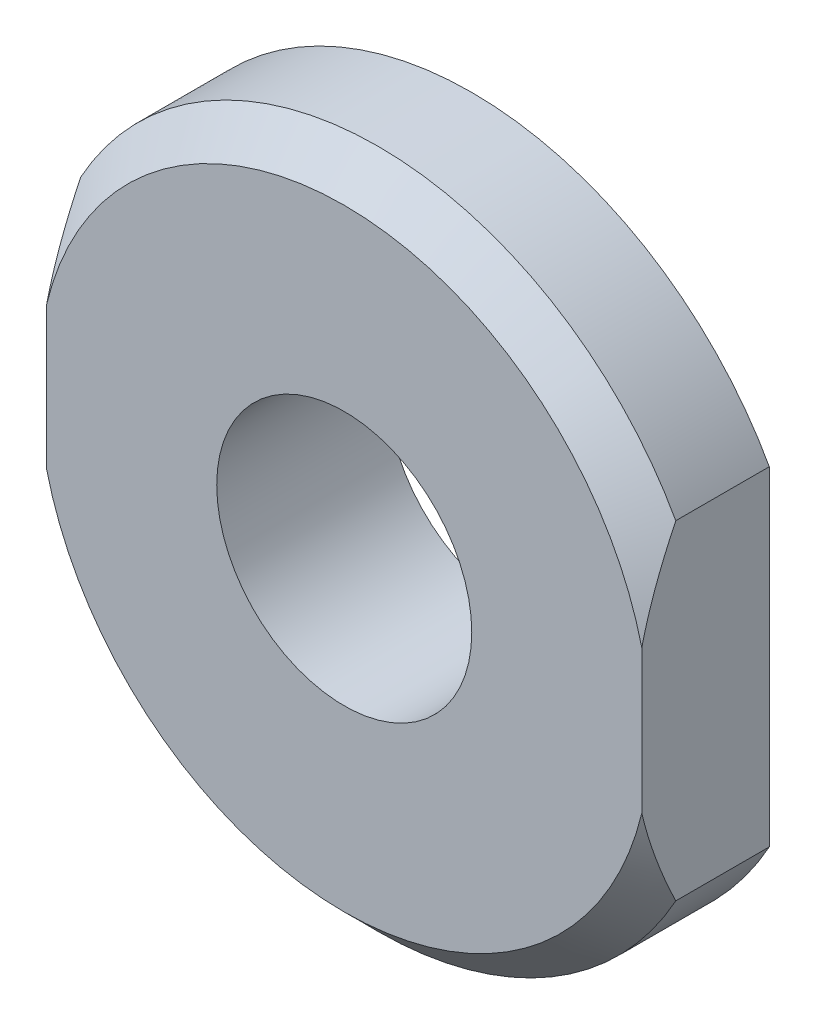
ISO-10303-21;
HEADER;
FILE_DESCRIPTION(('STEP AP214'),'2;1');
FILE_NAME('part.step','',(''),(''),'','','');
FILE_SCHEMA(('AUTOMOTIVE_DESIGN { 1 0 10303 214 1 1 1 1 }'));
ENDSEC;
DATA;
#1=APPLICATION_CONTEXT('core data for automotive mechanical design processes');
#2=APPLICATION_PROTOCOL_DEFINITION('international standard','automotive_design',2000,#1);
#3=PRODUCT_CONTEXT('',#1,'mechanical');
#4=PRODUCT('Part','Part','',(#3));
#5=PRODUCT_RELATED_PRODUCT_CATEGORY('part','',(#4));
#6=PRODUCT_DEFINITION_FORMATION('','',#4);
#7=PRODUCT_DEFINITION_CONTEXT('part definition',#1,'design');
#8=PRODUCT_DEFINITION('design','',#6,#7);
#9=PRODUCT_DEFINITION_SHAPE('','',#8);
#10=(LENGTH_UNIT() NAMED_UNIT(*) SI_UNIT(.MILLI.,.METRE.));
#11=(NAMED_UNIT(*) PLANE_ANGLE_UNIT() SI_UNIT($,.RADIAN.));
#12=(NAMED_UNIT(*) SI_UNIT($,.STERADIAN.) SOLID_ANGLE_UNIT());
#13=UNCERTAINTY_MEASURE_WITH_UNIT(LENGTH_MEASURE(1.E-05),#10,'distance_accuracy_value','');
#14=(GEOMETRIC_REPRESENTATION_CONTEXT(3) GLOBAL_UNCERTAINTY_ASSIGNED_CONTEXT((#13)) GLOBAL_UNIT_ASSIGNED_CONTEXT((#10,
#11,#12)) REPRESENTATION_CONTEXT('',''));
#15=CARTESIAN_POINT('',(0.,0.,0.));
#16=DIRECTION('',(0.,0.,1.));
#17=DIRECTION('',(1.,0.,0.));
#18=AXIS2_PLACEMENT_3D('',#15,#16,#17);
#19=CARTESIAN_POINT('',(0.,0.,1.5));
#20=DIRECTION('',(0.,0.,-1.));
#21=DIRECTION('',(-1.,0.,0.));
#22=AXIS2_PLACEMENT_3D('',#19,#20,#21);
#23=CYLINDRICAL_SURFACE('',#22,4.);
#24=DIRECTION('',(0.,0.,-1.));
#25=VECTOR('',#24,1.);
#26=CARTESIAN_POINT('',(3.5,-1.93649167310371,1.5));
#27=LINE('',#26,#25);
#28=CARTESIAN_POINT('',(3.5,-1.93649167310371,1.1));
#29=VERTEX_POINT('',#28);
#30=CARTESIAN_POINT('',(3.5,-1.93649167310371,0.));
#31=VERTEX_POINT('',#30);
#32=EDGE_CURVE('E99',#29,#31,#27,.T.);
#33=ORIENTED_EDGE('',*,*,#32,.F.);
#34=CARTESIAN_POINT('',(0.,0.,1.1));
#35=DIRECTION('',(0.,0.,1.));
#36=DIRECTION('',(1.,0.,0.));
#37=AXIS2_PLACEMENT_3D('',#34,#35,#36);
#38=CIRCLE('',#37,4.);
#39=CARTESIAN_POINT('',(-3.5,-1.93649167310371,1.1));
#40=VERTEX_POINT('',#39);
#41=EDGE_CURVE('E11',#29,#40,#38,.F.);
#42=ORIENTED_EDGE('',*,*,#41,.T.);
#43=DIRECTION('',(0.,0.,-1.));
#44=VECTOR('',#43,1.);
#45=CARTESIAN_POINT('',(-3.5,-1.93649167310371,1.5));
#46=LINE('',#45,#44);
#47=CARTESIAN_POINT('',(-3.5,-1.93649167310371,0.));
#48=VERTEX_POINT('',#47);
#49=EDGE_CURVE('E121',#40,#48,#46,.T.);
#50=ORIENTED_EDGE('',*,*,#49,.T.);
#51=CARTESIAN_POINT('',(0.,0.,0.));
#52=DIRECTION('',(0.,0.,1.));
#53=DIRECTION('',(1.,0.,0.));
#54=AXIS2_PLACEMENT_3D('',#51,#52,#53);
#55=CIRCLE('',#54,4.);
#56=EDGE_CURVE('E115',#48,#31,#55,.T.);
#57=ORIENTED_EDGE('',*,*,#56,.T.);
#58=EDGE_LOOP('',(#33,#42,#50,#57));
#59=FACE_BOUND('',#58,.T.);
#60=ADVANCED_FACE('F45',(#59),#23,.T.);
#61=CARTESIAN_POINT('',(3.5,1.93649167310371,1.5));
#62=DIRECTION('',(-1.,0.,0.));
#63=DIRECTION('',(0.,0.,1.));
#64=AXIS2_PLACEMENT_3D('',#61,#62,#63);
#65=PLANE('',#64);
#66=DIRECTION('',(0.,0.,-1.));
#67=VECTOR('',#66,1.);
#68=CARTESIAN_POINT('',(3.5,1.93649167310371,1.5));
#69=LINE('',#68,#67);
#70=CARTESIAN_POINT('',(3.5,1.93649167310371,1.1));
#71=VERTEX_POINT('',#70);
#72=CARTESIAN_POINT('',(3.5,1.93649167310371,0.));
#73=VERTEX_POINT('',#72);
#74=EDGE_CURVE('E109',#71,#73,#69,.T.);
#75=ORIENTED_EDGE('',*,*,#74,.F.);
#76=CARTESIAN_POINT('',(3.5,1.93649167310371,1.1));
#77=CARTESIAN_POINT('',(3.5,1.84885796034154,1.14241192293));
#78=CARTESIAN_POINT('',(3.5,1.76034011899979,1.18307345825536));
#79=CARTESIAN_POINT('',(3.5,1.58174808259513,1.26002292845541));
#80=CARTESIAN_POINT('',(3.5,1.49167942656025,1.29632376293444));
#81=CARTESIAN_POINT('',(3.5,1.30961778482799,1.36396363769677));
#82=CARTESIAN_POINT('',(3.5,1.21762379645835,1.39530001594116));
#83=CARTESIAN_POINT('',(3.5,1.03157611514035,1.45222420471047));
#84=CARTESIAN_POINT('',(3.5,0.937517002172146,1.47779421558135));
#85=CARTESIAN_POINT('',(3.5,0.842614977317646,1.5));
#86=B_SPLINE_CURVE_WITH_KNOTS('',3,(#76,#77,#78,#79,#80,#81,#82,#83,#84,#85),.UNSPECIFIED.,.F.,
.F.,(4,2,2,2,4),(0.,0.292100435962516,0.583314328026074,0.874683849988349,1.16694082338258),.UNSPECIFIED.);
#87=CARTESIAN_POINT('',(3.5,0.842614977317646,1.5));
#88=VERTEX_POINT('',#87);
#89=EDGE_CURVE('E56',#71,#88,#86,.T.);
#90=ORIENTED_EDGE('',*,*,#89,.T.);
#91=DIRECTION('',(0.,1.,0.));
#92=VECTOR('',#91,1.);
#93=CARTESIAN_POINT('',(3.5,1.93649167310371,1.5));
#94=LINE('',#93,#92);
#95=CARTESIAN_POINT('',(3.5,-0.842614977317645,1.5));
#96=VERTEX_POINT('',#95);
#97=EDGE_CURVE('E139',#96,#88,#94,.T.);
#98=ORIENTED_EDGE('',*,*,#97,.F.);
#99=CARTESIAN_POINT('',(3.5,-0.842614977317646,1.5));
#100=CARTESIAN_POINT('',(3.5,-0.937517002172147,1.47779421558135));
#101=CARTESIAN_POINT('',(3.5,-1.03157611514035,1.45222420471047));
#102=CARTESIAN_POINT('',(3.5,-1.21762379645835,1.39530001594116));
#103=CARTESIAN_POINT('',(3.5,-1.30961778482799,1.36396363769677));
#104=CARTESIAN_POINT('',(3.5,-1.49167942656025,1.29632376293444));
#105=CARTESIAN_POINT('',(3.5,-1.58174808259513,1.26002292845541));
#106=CARTESIAN_POINT('',(3.5,-1.76034011899979,1.18307345825535));
#107=CARTESIAN_POINT('',(3.5,-1.84885796034154,1.14241192293));
#108=CARTESIAN_POINT('',(3.5,-1.93649167310371,1.1));
#109=B_SPLINE_CURVE_WITH_KNOTS('',3,(#99,#100,#101,#102,#103,#104,#105,#106,#107,#108),
.UNSPECIFIED.,.F.,.F.,(4,2,2,2,4),(0.,0.292256973394233,0.583626495356509,0.874840387420067,
1.16694082338258),.UNSPECIFIED.);
#110=EDGE_CURVE('E63',#96,#29,#109,.T.);
#111=ORIENTED_EDGE('',*,*,#110,.T.);
#112=ORIENTED_EDGE('',*,*,#32,.T.);
#113=DIRECTION('',(0.,1.,0.));
#114=VECTOR('',#113,1.);
#115=CARTESIAN_POINT('',(3.5,1.93649167310371,0.));
#116=LINE('',#115,#114);
#117=EDGE_CURVE('E102',#31,#73,#116,.T.);
#118=ORIENTED_EDGE('',*,*,#117,.T.);
#119=EDGE_LOOP('',(#75,#90,#98,#111,#112,#118));
#120=FACE_BOUND('',#119,.T.);
#121=ADVANCED_FACE('F101',(#120),#65,.F.);
#122=CARTESIAN_POINT('',(0.,0.,1.5));
#123=DIRECTION('',(0.,0.,-1.));
#124=DIRECTION('',(-1.,0.,0.));
#125=AXIS2_PLACEMENT_3D('',#122,#123,#124);
#126=CYLINDRICAL_SURFACE('',#125,4.);
#127=DIRECTION('',(0.,0.,-1.));
#128=VECTOR('',#127,1.);
#129=CARTESIAN_POINT('',(-3.5,1.93649167310371,1.5));
#130=LINE('',#129,#128);
#131=CARTESIAN_POINT('',(-3.5,1.93649167310371,1.1));
#132=VERTEX_POINT('',#131);
#133=CARTESIAN_POINT('',(-3.5,1.93649167310371,0.));
#134=VERTEX_POINT('',#133);
#135=EDGE_CURVE('E142',#132,#134,#130,.T.);
#136=ORIENTED_EDGE('',*,*,#135,.F.);
#137=CARTESIAN_POINT('',(0.,0.,1.1));
#138=DIRECTION('',(0.,0.,1.));
#139=DIRECTION('',(1.,0.,0.));
#140=AXIS2_PLACEMENT_3D('',#137,#138,#139);
#141=CIRCLE('',#140,4.);
#142=EDGE_CURVE('E71',#132,#71,#141,.F.);
#143=ORIENTED_EDGE('',*,*,#142,.T.);
#144=ORIENTED_EDGE('',*,*,#74,.T.);
#145=CARTESIAN_POINT('',(0.,0.,0.));
#146=DIRECTION('',(0.,0.,1.));
#147=DIRECTION('',(1.,0.,0.));
#148=AXIS2_PLACEMENT_3D('',#145,#146,#147);
#149=CIRCLE('',#148,4.);
#150=EDGE_CURVE('E117',#73,#134,#149,.T.);
#151=ORIENTED_EDGE('',*,*,#150,.T.);
#152=EDGE_LOOP('',(#136,#143,#144,#151));
#153=FACE_BOUND('',#152,.T.);
#154=ADVANCED_FACE('F175',(#153),#126,.T.);
#155=CARTESIAN_POINT('',(-3.5,1.93649167310371,1.5));
#156=DIRECTION('',(1.,0.,0.));
#157=DIRECTION('',(0.,0.,-1.));
#158=AXIS2_PLACEMENT_3D('',#155,#156,#157);
#159=PLANE('',#158);
#160=DIRECTION('',(0.,-1.,0.));
#161=VECTOR('',#160,1.);
#162=CARTESIAN_POINT('',(-3.5,1.93649167310371,1.5));
#163=LINE('',#162,#161);
#164=CARTESIAN_POINT('',(-3.5,0.842614977317646,1.5));
#165=VERTEX_POINT('',#164);
#166=CARTESIAN_POINT('',(-3.5,-0.842614977317645,1.5));
#167=VERTEX_POINT('',#166);
#168=EDGE_CURVE('E131',#165,#167,#163,.T.);
#169=ORIENTED_EDGE('',*,*,#168,.F.);
#170=CARTESIAN_POINT('',(-3.5,0.842614977317646,1.5));
#171=CARTESIAN_POINT('',(-3.5,0.937517002172146,1.47779421558135));
#172=CARTESIAN_POINT('',(-3.5,1.03157611514035,1.45222420471047));
#173=CARTESIAN_POINT('',(-3.5,1.21762379645835,1.39530001594116));
#174=CARTESIAN_POINT('',(-3.5,1.30961778482799,1.36396363769677));
#175=CARTESIAN_POINT('',(-3.5,1.49167942656025,1.29632376293444));
#176=CARTESIAN_POINT('',(-3.5,1.58174808259513,1.26002292845541));
#177=CARTESIAN_POINT('',(-3.5,1.76034011899979,1.18307345825535));
#178=CARTESIAN_POINT('',(-3.5,1.84885796034154,1.14241192293));
#179=CARTESIAN_POINT('',(-3.5,1.93649167310371,1.1));
#180=B_SPLINE_CURVE_WITH_KNOTS('',3,(#170,#171,#172,#173,#174,#175,#176,#177,#178,#179),
.UNSPECIFIED.,.F.,.F.,(4,2,2,2,4),(0.,0.292256973394233,0.583626495356509,0.874840387420067,
1.16694082338258),.UNSPECIFIED.);
#181=EDGE_CURVE('E163',#165,#132,#180,.T.);
#182=ORIENTED_EDGE('',*,*,#181,.T.);
#183=ORIENTED_EDGE('',*,*,#135,.T.);
#184=DIRECTION('',(0.,-1.,0.));
#185=VECTOR('',#184,1.);
#186=CARTESIAN_POINT('',(-3.5,1.93649167310371,0.));
#187=LINE('',#186,#185);
#188=EDGE_CURVE('E136',#134,#48,#187,.T.);
#189=ORIENTED_EDGE('',*,*,#188,.T.);
#190=ORIENTED_EDGE('',*,*,#49,.F.);
#191=CARTESIAN_POINT('',(-3.5,-1.93649167310371,1.1));
#192=CARTESIAN_POINT('',(-3.5,-1.84885796034154,1.14241192293));
#193=CARTESIAN_POINT('',(-3.5,-1.76034011899979,1.18307345825535));
#194=CARTESIAN_POINT('',(-3.5,-1.58174808259513,1.26002292845541));
#195=CARTESIAN_POINT('',(-3.5,-1.49167942656025,1.29632376293444));
#196=CARTESIAN_POINT('',(-3.5,-1.30961778482799,1.36396363769677));
#197=CARTESIAN_POINT('',(-3.5,-1.21762379645835,1.39530001594116));
#198=CARTESIAN_POINT('',(-3.5,-1.03157611514035,1.45222420471047));
#199=CARTESIAN_POINT('',(-3.5,-0.937517002172147,1.47779421558135));
#200=CARTESIAN_POINT('',(-3.5,-0.842614977317647,1.5));
#201=B_SPLINE_CURVE_WITH_KNOTS('',3,(#191,#192,#193,#194,#195,#196,#197,#198,#199,#200),
.UNSPECIFIED.,.F.,.F.,(4,2,2,2,4),(0.,0.292100435962516,0.583314328026073,0.874683849988349,
1.16694082338258),.UNSPECIFIED.);
#202=EDGE_CURVE('E155',#40,#167,#201,.T.);
#203=ORIENTED_EDGE('',*,*,#202,.T.);
#204=EDGE_LOOP('',(#169,#182,#183,#189,#190,#203));
#205=FACE_BOUND('',#204,.T.);
#206=ADVANCED_FACE('F169',(#205),#159,.F.);
#207=CARTESIAN_POINT('',(0.,0.,1.5));
#208=DIRECTION('',(0.,0.,1.));
#209=DIRECTION('',(1.,0.,0.));
#210=AXIS2_PLACEMENT_3D('',#207,#208,#209);
#211=PLANE('',#210);
#212=CARTESIAN_POINT('',(0.,0.,1.5));
#213=DIRECTION('',(0.,0.,1.));
#214=DIRECTION('',(1.,0.,0.));
#215=AXIS2_PLACEMENT_3D('',#212,#213,#214);
#216=CIRCLE('',#215,1.5);
#217=CARTESIAN_POINT('',(1.5,0.,1.5));
#218=VERTEX_POINT('',#217);
#219=EDGE_CURVE('E316',#218,#218,#216,.T.);
#220=ORIENTED_EDGE('',*,*,#219,.F.);
#221=EDGE_LOOP('',(#220));
#222=FACE_BOUND('',#221,.T.);
#223=ORIENTED_EDGE('',*,*,#97,.T.);
#224=CARTESIAN_POINT('',(0.,0.,1.5));
#225=DIRECTION('',(0.,0.,1.));
#226=DIRECTION('',(1.,0.,0.));
#227=AXIS2_PLACEMENT_3D('',#224,#225,#226);
#228=CIRCLE('',#227,3.6);
#229=EDGE_CURVE('E151',#88,#165,#228,.T.);
#230=ORIENTED_EDGE('',*,*,#229,.T.);
#231=ORIENTED_EDGE('',*,*,#168,.T.);
#232=CARTESIAN_POINT('',(0.,0.,1.5));
#233=DIRECTION('',(0.,0.,1.));
#234=DIRECTION('',(1.,0.,0.));
#235=AXIS2_PLACEMENT_3D('',#232,#233,#234);
#236=CIRCLE('',#235,3.6);
#237=EDGE_CURVE('E147',#167,#96,#236,.T.);
#238=ORIENTED_EDGE('',*,*,#237,.T.);
#239=EDGE_LOOP('',(#223,#230,#231,#238));
#240=FACE_BOUND('',#239,.T.);
#241=ADVANCED_FACE('F174',(#222,#240),#211,.T.);
#242=CARTESIAN_POINT('',(0.,0.,0.));
#243=DIRECTION('',(0.,0.,1.));
#244=DIRECTION('',(1.,0.,0.));
#245=AXIS2_PLACEMENT_3D('',#242,#243,#244);
#246=PLANE('',#245);
#247=CARTESIAN_POINT('',(0.,0.,0.));
#248=DIRECTION('',(0.,0.,-1.));
#249=DIRECTION('',(-1.,0.,0.));
#250=AXIS2_PLACEMENT_3D('',#247,#248,#249);
#251=CIRCLE('',#250,2.5);
#252=CARTESIAN_POINT('',(-2.5,0.,0.));
#253=VERTEX_POINT('',#252);
#254=EDGE_CURVE('E108',#253,#253,#251,.T.);
#255=ORIENTED_EDGE('',*,*,#254,.F.);
#256=EDGE_LOOP('',(#255));
#257=FACE_BOUND('',#256,.T.);
#258=ORIENTED_EDGE('',*,*,#56,.F.);
#259=ORIENTED_EDGE('',*,*,#188,.F.);
#260=ORIENTED_EDGE('',*,*,#150,.F.);
#261=ORIENTED_EDGE('',*,*,#117,.F.);
#262=EDGE_LOOP('',(#258,#259,#260,#261));
#263=FACE_BOUND('',#262,.T.);
#264=ADVANCED_FACE('F113',(#257,#263),#246,.F.);
#265=CARTESIAN_POINT('',(0.,0.,-0.5));
#266=DIRECTION('',(0.,0.,1.));
#267=DIRECTION('',(1.,0.,0.));
#268=AXIS2_PLACEMENT_3D('',#265,#266,#267);
#269=CYLINDRICAL_SURFACE('',#268,2.5);
#270=CARTESIAN_POINT('',(0.,0.,-0.5));
#271=DIRECTION('',(0.,0.,-1.));
#272=DIRECTION('',(-1.,0.,0.));
#273=AXIS2_PLACEMENT_3D('',#270,#271,#272);
#274=CIRCLE('',#273,2.5);
#275=CARTESIAN_POINT('',(-2.5,0.,-0.5));
#276=VERTEX_POINT('',#275);
#277=EDGE_CURVE('E124',#276,#276,#274,.T.);
#278=ORIENTED_EDGE('',*,*,#277,.F.);
#279=EDGE_LOOP('',(#278));
#280=FACE_BOUND('',#279,.T.);
#281=ORIENTED_EDGE('',*,*,#254,.T.);
#282=EDGE_LOOP('',(#281));
#283=FACE_BOUND('',#282,.T.);
#284=ADVANCED_FACE('F210',(#280,#283),#269,.T.);
#285=CARTESIAN_POINT('',(0.,0.,-0.5));
#286=DIRECTION('',(0.,0.,-1.));
#287=DIRECTION('',(-1.,0.,0.));
#288=AXIS2_PLACEMENT_3D('',#285,#286,#287);
#289=PLANE('',#288);
#290=CARTESIAN_POINT('',(0.,0.,-0.5));
#291=DIRECTION('',(0.,0.,1.));
#292=DIRECTION('',(1.,0.,0.));
#293=AXIS2_PLACEMENT_3D('',#290,#291,#292);
#294=CIRCLE('',#293,1.5);
#295=CARTESIAN_POINT('',(1.5,0.,-0.5));
#296=VERTEX_POINT('',#295);
#297=EDGE_CURVE('E128',#296,#296,#294,.T.);
#298=ORIENTED_EDGE('',*,*,#297,.T.);
#299=EDGE_LOOP('',(#298));
#300=FACE_BOUND('',#299,.T.);
#301=ORIENTED_EDGE('',*,*,#277,.T.);
#302=EDGE_LOOP('',(#301));
#303=FACE_BOUND('',#302,.T.);
#304=ADVANCED_FACE('F201',(#300,#303),#289,.T.);
#305=CARTESIAN_POINT('',(0.,0.,1.5));
#306=DIRECTION('',(0.,0.,-1.));
#307=DIRECTION('',(-1.,0.,0.));
#308=AXIS2_PLACEMENT_3D('',#305,#306,#307);
#309=CONICAL_SURFACE('',#308,3.6,0.785398163397446);
#310=ORIENTED_EDGE('',*,*,#89,.F.);
#311=ORIENTED_EDGE('',*,*,#142,.F.);
#312=ORIENTED_EDGE('',*,*,#181,.F.);
#313=ORIENTED_EDGE('',*,*,#229,.F.);
#314=EDGE_LOOP('',(#310,#311,#312,#313));
#315=FACE_BOUND('',#314,.T.);
#316=ADVANCED_FACE('F196',(#315),#309,.T.);
#317=CARTESIAN_POINT('',(0.,0.,1.5));
#318=DIRECTION('',(0.,0.,-1.));
#319=DIRECTION('',(-1.,0.,0.));
#320=AXIS2_PLACEMENT_3D('',#317,#318,#319);
#321=CONICAL_SURFACE('',#320,3.6,0.785398163397446);
#322=ORIENTED_EDGE('',*,*,#202,.F.);
#323=ORIENTED_EDGE('',*,*,#41,.F.);
#324=ORIENTED_EDGE('',*,*,#110,.F.);
#325=ORIENTED_EDGE('',*,*,#237,.F.);
#326=EDGE_LOOP('',(#322,#323,#324,#325));
#327=FACE_BOUND('',#326,.T.);
#328=ADVANCED_FACE('F48',(#327),#321,.T.);
#329=CARTESIAN_POINT('',(0.,0.,1.5));
#330=DIRECTION('',(0.,0.,1.));
#331=DIRECTION('',(1.,0.,0.));
#332=AXIS2_PLACEMENT_3D('',#329,#330,#331);
#333=CYLINDRICAL_SURFACE('',#332,1.5);
#334=ORIENTED_EDGE('',*,*,#297,.F.);
#335=EDGE_LOOP('',(#334));
#336=FACE_BOUND('',#335,.T.);
#337=ORIENTED_EDGE('',*,*,#219,.T.);
#338=EDGE_LOOP('',(#337));
#339=FACE_BOUND('',#338,.T.);
#340=ADVANCED_FACE('F208',(#336,#339),#333,.F.);
#341=CLOSED_SHELL('',(#60,#121,#154,#206,#241,#264,#284,#304,#316,#328,#340));
#342=MANIFOLD_SOLID_BREP('B2',#341);
#343=ADVANCED_BREP_SHAPE_REPRESENTATION('',(#18,#342),#14);
#344=SHAPE_DEFINITION_REPRESENTATION(#9,#343);
ENDSEC;
END-ISO-10303-21;
